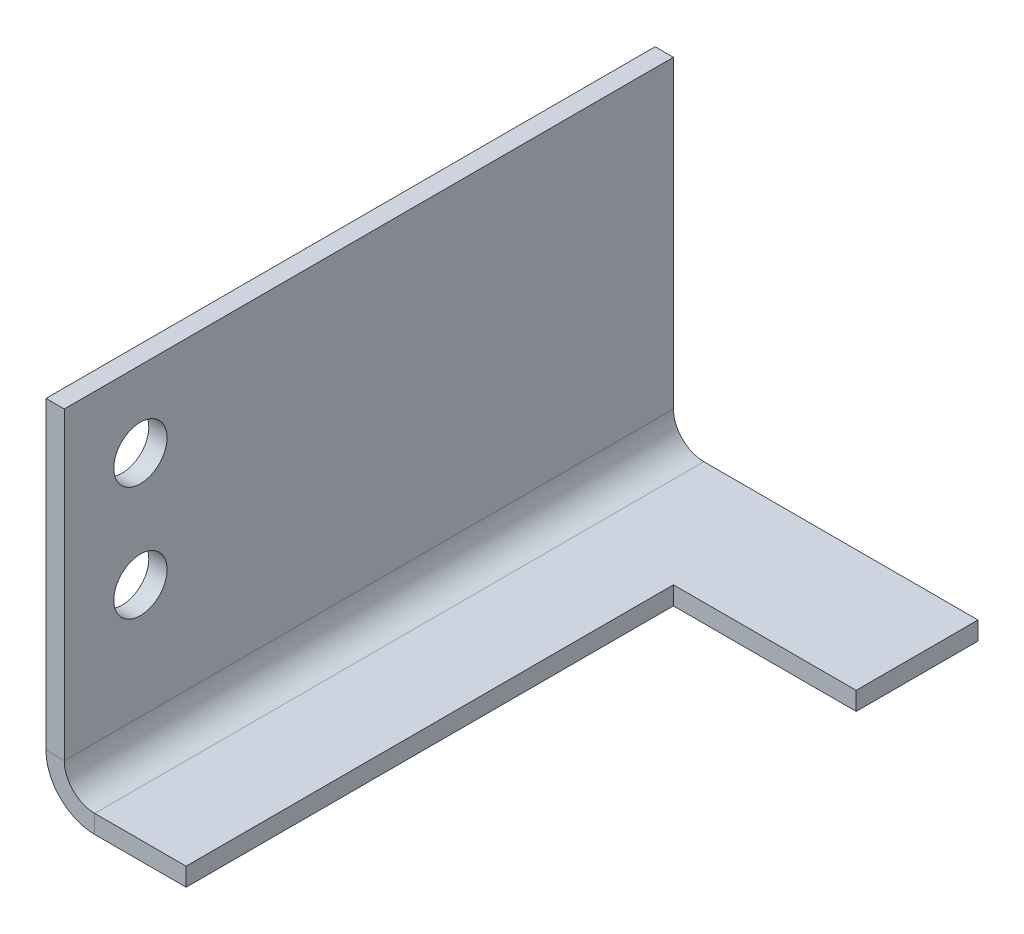
ISO-10303-21;
HEADER;
FILE_DESCRIPTION(('STEP AP214'),'2;1');
FILE_NAME('part.step','',(''),(''),'','','');
FILE_SCHEMA(('AUTOMOTIVE_DESIGN { 1 0 10303 214 1 1 1 1 }'));
ENDSEC;
DATA;
#1=APPLICATION_CONTEXT('core data for automotive mechanical design processes');
#2=APPLICATION_PROTOCOL_DEFINITION('international standard','automotive_design',2000,#1);
#3=PRODUCT_CONTEXT('',#1,'mechanical');
#4=PRODUCT('Part','Part','',(#3));
#5=PRODUCT_RELATED_PRODUCT_CATEGORY('part','',(#4));
#6=PRODUCT_DEFINITION_FORMATION('','',#4);
#7=PRODUCT_DEFINITION_CONTEXT('part definition',#1,'design');
#8=PRODUCT_DEFINITION('design','',#6,#7);
#9=PRODUCT_DEFINITION_SHAPE('','',#8);
#10=(LENGTH_UNIT() NAMED_UNIT(*) SI_UNIT(.MILLI.,.METRE.));
#11=(NAMED_UNIT(*) PLANE_ANGLE_UNIT() SI_UNIT($,.RADIAN.));
#12=(NAMED_UNIT(*) SI_UNIT($,.STERADIAN.) SOLID_ANGLE_UNIT());
#13=UNCERTAINTY_MEASURE_WITH_UNIT(LENGTH_MEASURE(1.E-05),#10,'distance_accuracy_value','');
#14=(GEOMETRIC_REPRESENTATION_CONTEXT(3) GLOBAL_UNCERTAINTY_ASSIGNED_CONTEXT((#13)) GLOBAL_UNIT_ASSIGNED_CONTEXT((#10,
#11,#12)) REPRESENTATION_CONTEXT('',''));
#15=CARTESIAN_POINT('',(0.,0.,0.));
#16=DIRECTION('',(0.,0.,1.));
#17=DIRECTION('',(1.,0.,0.));
#18=AXIS2_PLACEMENT_3D('',#15,#16,#17);
#19=CARTESIAN_POINT('',(2.,-22.,10.));
#20=DIRECTION('',(0.,0.,1.));
#21=DIRECTION('',(1.,0.,0.));
#22=AXIS2_PLACEMENT_3D('',#19,#20,#21);
#23=PLANE('',#22);
#24=DIRECTION('',(0.,-1.,0.));
#25=VECTOR('',#24,1.);
#26=CARTESIAN_POINT('',(2.,-22.,10.));
#27=LINE('',#26,#25);
#28=CARTESIAN_POINT('',(2.,-22.,10.));
#29=VERTEX_POINT('',#28);
#30=CARTESIAN_POINT('',(2.,-23.2,10.));
#31=VERTEX_POINT('',#30);
#32=EDGE_CURVE('E11',#29,#31,#27,.T.);
#33=ORIENTED_EDGE('',*,*,#32,.F.);
#34=CARTESIAN_POINT('',(2.,-20.,10.));
#35=DIRECTION('',(0.,0.,-1.));
#36=DIRECTION('',(-1.,0.,0.));
#37=AXIS2_PLACEMENT_3D('',#34,#35,#36);
#38=CIRCLE('',#37,2.);
#39=CARTESIAN_POINT('',(0.,-20.,10.));
#40=VERTEX_POINT('',#39);
#41=EDGE_CURVE('E172',#40,#29,#38,.F.);
#42=ORIENTED_EDGE('',*,*,#41,.F.);
#43=DIRECTION('',(1.,0.,0.));
#44=VECTOR('',#43,1.);
#45=CARTESIAN_POINT('',(-1.2,-20.,10.));
#46=LINE('',#45,#44);
#47=CARTESIAN_POINT('',(-1.2,-20.,10.));
#48=VERTEX_POINT('',#47);
#49=EDGE_CURVE('E43',#48,#40,#46,.T.);
#50=ORIENTED_EDGE('',*,*,#49,.F.);
#51=CARTESIAN_POINT('',(2.,-20.,10.));
#52=DIRECTION('',(0.,0.,1.));
#53=DIRECTION('',(1.,0.,0.));
#54=AXIS2_PLACEMENT_3D('',#51,#52,#53);
#55=CIRCLE('',#54,3.2);
#56=EDGE_CURVE('E184',#48,#31,#55,.T.);
#57=ORIENTED_EDGE('',*,*,#56,.T.);
#58=EDGE_LOOP('',(#33,#42,#50,#57));
#59=FACE_BOUND('',#58,.T.);
#60=ADVANCED_FACE('F35',(#59),#23,.T.);
#61=CARTESIAN_POINT('',(-1.2,-20.,10.));
#62=DIRECTION('',(0.,0.,1.));
#63=DIRECTION('',(1.,0.,0.));
#64=AXIS2_PLACEMENT_3D('',#61,#62,#63);
#65=PLANE('',#64);
#66=DIRECTION('',(0.,1.,0.));
#67=VECTOR('',#66,1.);
#68=CARTESIAN_POINT('',(8.,-32.,10.));
#69=LINE('',#68,#67);
#70=CARTESIAN_POINT('',(8.,-23.2,10.));
#71=VERTEX_POINT('',#70);
#72=CARTESIAN_POINT('',(8.,-22.,10.));
#73=VERTEX_POINT('',#72);
#74=EDGE_CURVE('E120',#71,#73,#69,.T.);
#75=ORIENTED_EDGE('',*,*,#74,.T.);
#76=DIRECTION('',(1.,0.,0.));
#77=VECTOR('',#76,1.);
#78=CARTESIAN_POINT('',(0.,-22.,10.));
#79=LINE('',#78,#77);
#80=EDGE_CURVE('E130',#29,#73,#79,.T.);
#81=ORIENTED_EDGE('',*,*,#80,.F.);
#82=ORIENTED_EDGE('',*,*,#32,.T.);
#83=DIRECTION('',(1.,0.,0.));
#84=VECTOR('',#83,1.);
#85=CARTESIAN_POINT('',(0.,-23.2,10.));
#86=LINE('',#85,#84);
#87=EDGE_CURVE('E169',#31,#71,#86,.T.);
#88=ORIENTED_EDGE('',*,*,#87,.T.);
#89=EDGE_LOOP('',(#75,#81,#82,#88));
#90=FACE_BOUND('',#89,.T.);
#91=ADVANCED_FACE('F225',(#90),#65,.T.);
#92=CARTESIAN_POINT('',(0.,-23.2,10.));
#93=DIRECTION('',(0.,1.,0.));
#94=DIRECTION('',(0.,0.,1.));
#95=AXIS2_PLACEMENT_3D('',#92,#93,#94);
#96=PLANE('',#95);
#97=DIRECTION('',(-1.,0.,0.));
#98=VECTOR('',#97,1.);
#99=CARTESIAN_POINT('',(0.,-23.2,-22.));
#100=LINE('',#99,#98);
#101=CARTESIAN_POINT('',(20.,-23.2,-22.));
#102=VERTEX_POINT('',#101);
#103=CARTESIAN_POINT('',(8.,-23.2,-22.));
#104=VERTEX_POINT('',#103);
#105=EDGE_CURVE('E134',#102,#104,#100,.T.);
#106=ORIENTED_EDGE('',*,*,#105,.T.);
#107=DIRECTION('',(0.,0.,1.));
#108=VECTOR('',#107,1.);
#109=CARTESIAN_POINT('',(8.,-23.2,10.));
#110=LINE('',#109,#108);
#111=EDGE_CURVE('E118',#104,#71,#110,.T.);
#112=ORIENTED_EDGE('',*,*,#111,.T.);
#113=ORIENTED_EDGE('',*,*,#87,.F.);
#114=DIRECTION('',(0.,0.,-1.));
#115=VECTOR('',#114,1.);
#116=CARTESIAN_POINT('',(2.,-23.2,10.));
#117=LINE('',#116,#115);
#118=CARTESIAN_POINT('',(2.,-23.2,-30.));
#119=VERTEX_POINT('',#118);
#120=EDGE_CURVE('E186',#31,#119,#117,.T.);
#121=ORIENTED_EDGE('',*,*,#120,.T.);
#122=DIRECTION('',(-1.,0.,0.));
#123=VECTOR('',#122,1.);
#124=CARTESIAN_POINT('',(20.,-23.2,-30.));
#125=LINE('',#124,#123);
#126=CARTESIAN_POINT('',(20.,-23.2,-30.));
#127=VERTEX_POINT('',#126);
#128=EDGE_CURVE('E153',#127,#119,#125,.T.);
#129=ORIENTED_EDGE('',*,*,#128,.F.);
#130=DIRECTION('',(0.,0.,-1.));
#131=VECTOR('',#130,1.);
#132=CARTESIAN_POINT('',(20.,-23.2,10.));
#133=LINE('',#132,#131);
#134=EDGE_CURVE('E200',#102,#127,#133,.T.);
#135=ORIENTED_EDGE('',*,*,#134,.F.);
#136=EDGE_LOOP('',(#106,#112,#113,#121,#129,#135));
#137=FACE_BOUND('',#136,.T.);
#138=ADVANCED_FACE('F230',(#137),#96,.F.);
#139=CARTESIAN_POINT('',(20.,-22.,10.));
#140=DIRECTION('',(1.,0.,0.));
#141=DIRECTION('',(0.,0.,-1.));
#142=AXIS2_PLACEMENT_3D('',#139,#140,#141);
#143=PLANE('',#142);
#144=DIRECTION('',(0.,1.,0.));
#145=VECTOR('',#144,1.);
#146=CARTESIAN_POINT('',(20.,-32.,-22.));
#147=LINE('',#146,#145);
#148=CARTESIAN_POINT('',(20.,-22.,-22.));
#149=VERTEX_POINT('',#148);
#150=EDGE_CURVE('E51',#102,#149,#147,.T.);
#151=ORIENTED_EDGE('',*,*,#150,.F.);
#152=ORIENTED_EDGE('',*,*,#134,.T.);
#153=DIRECTION('',(0.,-1.,0.));
#154=VECTOR('',#153,1.);
#155=CARTESIAN_POINT('',(20.,-22.,-30.));
#156=LINE('',#155,#154);
#157=CARTESIAN_POINT('',(20.,-22.,-30.));
#158=VERTEX_POINT('',#157);
#159=EDGE_CURVE('E150',#158,#127,#156,.T.);
#160=ORIENTED_EDGE('',*,*,#159,.F.);
#161=DIRECTION('',(0.,0.,-1.));
#162=VECTOR('',#161,1.);
#163=CARTESIAN_POINT('',(20.,-22.,10.));
#164=LINE('',#163,#162);
#165=EDGE_CURVE('E198',#149,#158,#164,.T.);
#166=ORIENTED_EDGE('',*,*,#165,.F.);
#167=EDGE_LOOP('',(#151,#152,#160,#166));
#168=FACE_BOUND('',#167,.T.);
#169=ADVANCED_FACE('F258',(#168),#143,.T.);
#170=CARTESIAN_POINT('',(0.,-22.,10.));
#171=DIRECTION('',(0.,1.,0.));
#172=DIRECTION('',(0.,0.,1.));
#173=AXIS2_PLACEMENT_3D('',#170,#171,#172);
#174=PLANE('',#173);
#175=DIRECTION('',(0.,0.,1.));
#176=VECTOR('',#175,1.);
#177=CARTESIAN_POINT('',(8.,-22.,10.));
#178=LINE('',#177,#176);
#179=CARTESIAN_POINT('',(8.,-22.,-22.));
#180=VERTEX_POINT('',#179);
#181=EDGE_CURVE('E115',#180,#73,#178,.T.);
#182=ORIENTED_EDGE('',*,*,#181,.F.);
#183=DIRECTION('',(-1.,0.,0.));
#184=VECTOR('',#183,1.);
#185=CARTESIAN_POINT('',(20.,-22.,-22.));
#186=LINE('',#185,#184);
#187=EDGE_CURVE('E122',#149,#180,#186,.T.);
#188=ORIENTED_EDGE('',*,*,#187,.F.);
#189=ORIENTED_EDGE('',*,*,#165,.T.);
#190=DIRECTION('',(1.,0.,0.));
#191=VECTOR('',#190,1.);
#192=CARTESIAN_POINT('',(2.,-22.,-30.));
#193=LINE('',#192,#191);
#194=CARTESIAN_POINT('',(2.,-22.,-30.));
#195=VERTEX_POINT('',#194);
#196=EDGE_CURVE('E147',#195,#158,#193,.T.);
#197=ORIENTED_EDGE('',*,*,#196,.F.);
#198=DIRECTION('',(0.,0.,-1.));
#199=VECTOR('',#198,1.);
#200=CARTESIAN_POINT('',(2.,-22.,10.));
#201=LINE('',#200,#199);
#202=EDGE_CURVE('E196',#29,#195,#201,.T.);
#203=ORIENTED_EDGE('',*,*,#202,.F.);
#204=ORIENTED_EDGE('',*,*,#80,.T.);
#205=EDGE_LOOP('',(#182,#188,#189,#197,#203,#204));
#206=FACE_BOUND('',#205,.T.);
#207=ADVANCED_FACE('F128',(#206),#174,.T.);
#208=CARTESIAN_POINT('',(2.,-20.,10.));
#209=DIRECTION('',(0.,0.,-1.));
#210=DIRECTION('',(-1.,0.,0.));
#211=AXIS2_PLACEMENT_3D('',#208,#209,#210);
#212=CYLINDRICAL_SURFACE('',#211,2.);
#213=ORIENTED_EDGE('',*,*,#202,.T.);
#214=CARTESIAN_POINT('',(2.,-20.,-30.));
#215=DIRECTION('',(0.,0.,1.));
#216=DIRECTION('',(-1.,0.,0.));
#217=AXIS2_PLACEMENT_3D('',#214,#215,#216);
#218=CIRCLE('',#217,2.);
#219=CARTESIAN_POINT('',(0.,-20.,-30.));
#220=VERTEX_POINT('',#219);
#221=EDGE_CURVE('E144',#220,#195,#218,.T.);
#222=ORIENTED_EDGE('',*,*,#221,.F.);
#223=DIRECTION('',(0.,0.,-1.));
#224=VECTOR('',#223,1.);
#225=CARTESIAN_POINT('',(0.,-20.,10.));
#226=LINE('',#225,#224);
#227=EDGE_CURVE('E194',#40,#220,#226,.T.);
#228=ORIENTED_EDGE('',*,*,#227,.F.);
#229=ORIENTED_EDGE('',*,*,#41,.T.);
#230=EDGE_LOOP('',(#213,#222,#228,#229));
#231=FACE_BOUND('',#230,.T.);
#232=ADVANCED_FACE('F238',(#231),#212,.F.);
#233=CARTESIAN_POINT('',(0.,0.,10.));
#234=DIRECTION('',(1.,0.,0.));
#235=DIRECTION('',(0.,1.,0.));
#236=AXIS2_PLACEMENT_3D('',#233,#234,#235);
#237=PLANE('',#236);
#238=CARTESIAN_POINT('',(0.,-12.5,5.));
#239=DIRECTION('',(1.,0.,0.));
#240=DIRECTION('',(0.,1.,0.));
#241=AXIS2_PLACEMENT_3D('',#238,#239,#240);
#242=CIRCLE('',#241,1.75);
#243=CARTESIAN_POINT('',(0.,-10.75,5.));
#244=VERTEX_POINT('',#243);
#245=EDGE_CURVE('E162',#244,#244,#242,.T.);
#246=ORIENTED_EDGE('',*,*,#245,.F.);
#247=EDGE_LOOP('',(#246));
#248=FACE_BOUND('',#247,.T.);
#249=CARTESIAN_POINT('',(0.,-5.,5.));
#250=DIRECTION('',(1.,0.,0.));
#251=DIRECTION('',(0.,1.,0.));
#252=AXIS2_PLACEMENT_3D('',#249,#250,#251);
#253=CIRCLE('',#252,1.75);
#254=CARTESIAN_POINT('',(0.,-3.25,5.));
#255=VERTEX_POINT('',#254);
#256=EDGE_CURVE('E165',#255,#255,#253,.T.);
#257=ORIENTED_EDGE('',*,*,#256,.F.);
#258=EDGE_LOOP('',(#257));
#259=FACE_BOUND('',#258,.T.);
#260=ORIENTED_EDGE('',*,*,#227,.T.);
#261=DIRECTION('',(0.,-1.,0.));
#262=VECTOR('',#261,1.);
#263=CARTESIAN_POINT('',(0.,0.,-30.));
#264=LINE('',#263,#262);
#265=CARTESIAN_POINT('',(0.,0.,-30.));
#266=VERTEX_POINT('',#265);
#267=EDGE_CURVE('E141',#266,#220,#264,.T.);
#268=ORIENTED_EDGE('',*,*,#267,.F.);
#269=DIRECTION('',(0.,0.,-1.));
#270=VECTOR('',#269,1.);
#271=CARTESIAN_POINT('',(0.,0.,10.));
#272=LINE('',#271,#270);
#273=CARTESIAN_POINT('',(0.,0.,10.));
#274=VERTEX_POINT('',#273);
#275=EDGE_CURVE('E192',#274,#266,#272,.T.);
#276=ORIENTED_EDGE('',*,*,#275,.F.);
#277=DIRECTION('',(0.,-1.,0.));
#278=VECTOR('',#277,1.);
#279=CARTESIAN_POINT('',(0.,0.,10.));
#280=LINE('',#279,#278);
#281=EDGE_CURVE('E175',#274,#40,#280,.T.);
#282=ORIENTED_EDGE('',*,*,#281,.T.);
#283=EDGE_LOOP('',(#260,#268,#276,#282));
#284=FACE_BOUND('',#283,.T.);
#285=ADVANCED_FACE('F241',(#248,#259,#284),#237,.T.);
#286=CARTESIAN_POINT('',(-1.2,0.,10.));
#287=DIRECTION('',(0.,1.,0.));
#288=DIRECTION('',(-1.,0.,0.));
#289=AXIS2_PLACEMENT_3D('',#286,#287,#288);
#290=PLANE('',#289);
#291=ORIENTED_EDGE('',*,*,#275,.T.);
#292=DIRECTION('',(1.,0.,0.));
#293=VECTOR('',#292,1.);
#294=CARTESIAN_POINT('',(-1.2,0.,-30.));
#295=LINE('',#294,#293);
#296=CARTESIAN_POINT('',(-1.2,0.,-30.));
#297=VERTEX_POINT('',#296);
#298=EDGE_CURVE('E138',#297,#266,#295,.T.);
#299=ORIENTED_EDGE('',*,*,#298,.F.);
#300=DIRECTION('',(0.,0.,-1.));
#301=VECTOR('',#300,1.);
#302=CARTESIAN_POINT('',(-1.2,0.,10.));
#303=LINE('',#302,#301);
#304=CARTESIAN_POINT('',(-1.2,0.,10.));
#305=VERTEX_POINT('',#304);
#306=EDGE_CURVE('E190',#305,#297,#303,.T.);
#307=ORIENTED_EDGE('',*,*,#306,.F.);
#308=DIRECTION('',(1.,0.,0.));
#309=VECTOR('',#308,1.);
#310=CARTESIAN_POINT('',(-1.2,0.,10.));
#311=LINE('',#310,#309);
#312=EDGE_CURVE('E178',#305,#274,#311,.T.);
#313=ORIENTED_EDGE('',*,*,#312,.T.);
#314=EDGE_LOOP('',(#291,#299,#307,#313));
#315=FACE_BOUND('',#314,.T.);
#316=ADVANCED_FACE('F247',(#315),#290,.T.);
#317=CARTESIAN_POINT('',(-1.2,0.,10.));
#318=DIRECTION('',(1.,0.,0.));
#319=DIRECTION('',(0.,1.,0.));
#320=AXIS2_PLACEMENT_3D('',#317,#318,#319);
#321=PLANE('',#320);
#322=CARTESIAN_POINT('',(-1.2,-12.5,5.));
#323=DIRECTION('',(1.,0.,0.));
#324=DIRECTION('',(0.,1.,0.));
#325=AXIS2_PLACEMENT_3D('',#322,#323,#324);
#326=CIRCLE('',#325,1.75);
#327=CARTESIAN_POINT('',(-1.2,-10.75,5.));
#328=VERTEX_POINT('',#327);
#329=EDGE_CURVE('E38',#328,#328,#326,.T.);
#330=ORIENTED_EDGE('',*,*,#329,.T.);
#331=EDGE_LOOP('',(#330));
#332=FACE_BOUND('',#331,.T.);
#333=CARTESIAN_POINT('',(-1.2,-5.,5.));
#334=DIRECTION('',(1.,0.,0.));
#335=DIRECTION('',(0.,1.,0.));
#336=AXIS2_PLACEMENT_3D('',#333,#334,#335);
#337=CIRCLE('',#336,1.75);
#338=CARTESIAN_POINT('',(-1.2,-3.25,5.));
#339=VERTEX_POINT('',#338);
#340=EDGE_CURVE('E168',#339,#339,#337,.T.);
#341=ORIENTED_EDGE('',*,*,#340,.T.);
#342=EDGE_LOOP('',(#341));
#343=FACE_BOUND('',#342,.T.);
#344=ORIENTED_EDGE('',*,*,#306,.T.);
#345=DIRECTION('',(0.,1.,0.));
#346=VECTOR('',#345,1.);
#347=CARTESIAN_POINT('',(-1.2,-20.,-30.));
#348=LINE('',#347,#346);
#349=CARTESIAN_POINT('',(-1.2,-20.,-30.));
#350=VERTEX_POINT('',#349);
#351=EDGE_CURVE('E159',#350,#297,#348,.T.);
#352=ORIENTED_EDGE('',*,*,#351,.F.);
#353=DIRECTION('',(0.,0.,-1.));
#354=VECTOR('',#353,1.);
#355=CARTESIAN_POINT('',(-1.2,-20.,10.));
#356=LINE('',#355,#354);
#357=EDGE_CURVE('E188',#48,#350,#356,.T.);
#358=ORIENTED_EDGE('',*,*,#357,.F.);
#359=DIRECTION('',(0.,-1.,0.));
#360=VECTOR('',#359,1.);
#361=CARTESIAN_POINT('',(-1.2,0.,10.));
#362=LINE('',#361,#360);
#363=EDGE_CURVE('E181',#305,#48,#362,.T.);
#364=ORIENTED_EDGE('',*,*,#363,.F.);
#365=EDGE_LOOP('',(#344,#352,#358,#364));
#366=FACE_BOUND('',#365,.T.);
#367=ADVANCED_FACE('F205',(#332,#343,#366),#321,.F.);
#368=CARTESIAN_POINT('',(2.,-20.,10.));
#369=DIRECTION('',(0.,0.,-1.));
#370=DIRECTION('',(-1.,0.,0.));
#371=AXIS2_PLACEMENT_3D('',#368,#369,#370);
#372=CYLINDRICAL_SURFACE('',#371,3.2);
#373=ORIENTED_EDGE('',*,*,#357,.T.);
#374=CARTESIAN_POINT('',(2.,-20.,-30.));
#375=DIRECTION('',(0.,0.,-1.));
#376=DIRECTION('',(-1.,0.,0.));
#377=AXIS2_PLACEMENT_3D('',#374,#375,#376);
#378=CIRCLE('',#377,3.2);
#379=EDGE_CURVE('E156',#119,#350,#378,.T.);
#380=ORIENTED_EDGE('',*,*,#379,.F.);
#381=ORIENTED_EDGE('',*,*,#120,.F.);
#382=ORIENTED_EDGE('',*,*,#56,.F.);
#383=EDGE_LOOP('',(#373,#380,#381,#382));
#384=FACE_BOUND('',#383,.T.);
#385=ADVANCED_FACE('F221',(#384),#372,.T.);
#386=CARTESIAN_POINT('',(2.,-20.,10.));
#387=DIRECTION('',(0.,0.,-1.));
#388=DIRECTION('',(-1.,0.,0.));
#389=AXIS2_PLACEMENT_3D('',#386,#387,#388);
#390=PLANE('',#389);
#391=ORIENTED_EDGE('',*,*,#363,.T.);
#392=ORIENTED_EDGE('',*,*,#49,.T.);
#393=ORIENTED_EDGE('',*,*,#281,.F.);
#394=ORIENTED_EDGE('',*,*,#312,.F.);
#395=EDGE_LOOP('',(#391,#392,#393,#394));
#396=FACE_BOUND('',#395,.T.);
#397=ADVANCED_FACE('F211',(#396),#390,.F.);
#398=CARTESIAN_POINT('',(-10.,-5.,5.));
#399=DIRECTION('',(1.,0.,0.));
#400=DIRECTION('',(0.,1.,0.));
#401=AXIS2_PLACEMENT_3D('',#398,#399,#400);
#402=CYLINDRICAL_SURFACE('',#401,1.75);
#403=ORIENTED_EDGE('',*,*,#256,.T.);
#404=EDGE_LOOP('',(#403));
#405=FACE_BOUND('',#404,.T.);
#406=ORIENTED_EDGE('',*,*,#340,.F.);
#407=EDGE_LOOP('',(#406));
#408=FACE_BOUND('',#407,.T.);
#409=ADVANCED_FACE('F208',(#405,#408),#402,.F.);
#410=CARTESIAN_POINT('',(-10.,-12.5,5.));
#411=DIRECTION('',(1.,0.,0.));
#412=DIRECTION('',(0.,1.,0.));
#413=AXIS2_PLACEMENT_3D('',#410,#411,#412);
#414=CYLINDRICAL_SURFACE('',#413,1.75);
#415=ORIENTED_EDGE('',*,*,#245,.T.);
#416=EDGE_LOOP('',(#415));
#417=FACE_BOUND('',#416,.T.);
#418=ORIENTED_EDGE('',*,*,#329,.F.);
#419=EDGE_LOOP('',(#418));
#420=FACE_BOUND('',#419,.T.);
#421=ADVANCED_FACE('F210',(#417,#420),#414,.F.);
#422=CARTESIAN_POINT('',(2.,-20.,-30.));
#423=DIRECTION('',(0.,0.,-1.));
#424=DIRECTION('',(-1.,0.,0.));
#425=AXIS2_PLACEMENT_3D('',#422,#423,#424);
#426=PLANE('',#425);
#427=ORIENTED_EDGE('',*,*,#298,.T.);
#428=ORIENTED_EDGE('',*,*,#267,.T.);
#429=ORIENTED_EDGE('',*,*,#221,.T.);
#430=ORIENTED_EDGE('',*,*,#196,.T.);
#431=ORIENTED_EDGE('',*,*,#159,.T.);
#432=ORIENTED_EDGE('',*,*,#128,.T.);
#433=ORIENTED_EDGE('',*,*,#379,.T.);
#434=ORIENTED_EDGE('',*,*,#351,.T.);
#435=EDGE_LOOP('',(#427,#428,#429,#430,#431,#432,#433,#434));
#436=FACE_BOUND('',#435,.T.);
#437=ADVANCED_FACE('F218',(#436),#426,.T.);
#438=CARTESIAN_POINT('',(8.,-32.,10.));
#439=DIRECTION('',(-1.,0.,0.));
#440=DIRECTION('',(0.,0.,1.));
#441=AXIS2_PLACEMENT_3D('',#438,#439,#440);
#442=PLANE('',#441);
#443=DIRECTION('',(0.,1.,0.));
#444=VECTOR('',#443,1.);
#445=CARTESIAN_POINT('',(8.,-32.,-22.));
#446=LINE('',#445,#444);
#447=EDGE_CURVE('E112',#104,#180,#446,.T.);
#448=ORIENTED_EDGE('',*,*,#447,.T.);
#449=ORIENTED_EDGE('',*,*,#181,.T.);
#450=ORIENTED_EDGE('',*,*,#74,.F.);
#451=ORIENTED_EDGE('',*,*,#111,.F.);
#452=EDGE_LOOP('',(#448,#449,#450,#451));
#453=FACE_BOUND('',#452,.T.);
#454=ADVANCED_FACE('F113',(#453),#442,.F.);
#455=CARTESIAN_POINT('',(20.,-32.,-22.));
#456=DIRECTION('',(0.,0.,-1.));
#457=DIRECTION('',(-1.,0.,0.));
#458=AXIS2_PLACEMENT_3D('',#455,#456,#457);
#459=PLANE('',#458);
#460=ORIENTED_EDGE('',*,*,#150,.T.);
#461=ORIENTED_EDGE('',*,*,#187,.T.);
#462=ORIENTED_EDGE('',*,*,#447,.F.);
#463=ORIENTED_EDGE('',*,*,#105,.F.);
#464=EDGE_LOOP('',(#460,#461,#462,#463));
#465=FACE_BOUND('',#464,.T.);
#466=ADVANCED_FACE('F123',(#465),#459,.F.);
#467=CLOSED_SHELL('',(#60,#91,#138,#169,#207,#232,#285,#316,#367,#385,#397,#409,#421,#437,#454,#466));
#468=MANIFOLD_SOLID_BREP('B2',#467);
#469=ADVANCED_BREP_SHAPE_REPRESENTATION('',(#18,#468),#14);
#470=SHAPE_DEFINITION_REPRESENTATION(#9,#469);
ENDSEC;
END-ISO-10303-21;
